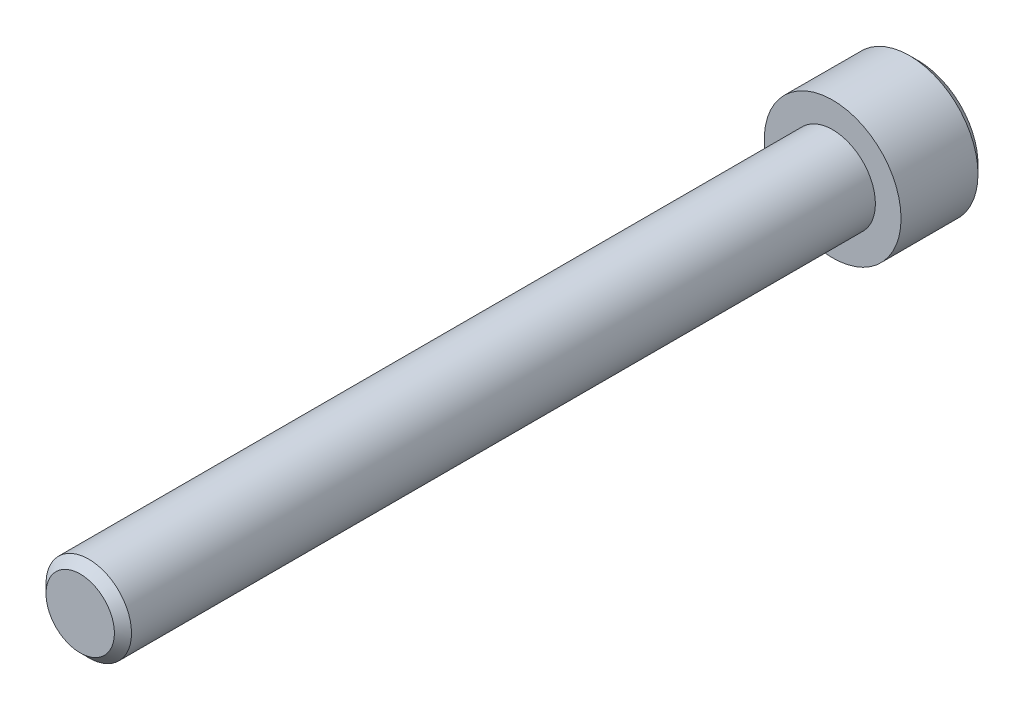
ISO-10303-21;
HEADER;
FILE_DESCRIPTION(('STEP AP214'),'2;1');
FILE_NAME('part.step','',(''),(''),'','','');
FILE_SCHEMA(('AUTOMOTIVE_DESIGN { 1 0 10303 214 1 1 1 1 }'));
ENDSEC;
DATA;
#1=APPLICATION_CONTEXT('core data for automotive mechanical design processes');
#2=APPLICATION_PROTOCOL_DEFINITION('international standard','automotive_design',2000,#1);
#3=PRODUCT_CONTEXT('',#1,'mechanical');
#4=PRODUCT('Part','Part','',(#3));
#5=PRODUCT_RELATED_PRODUCT_CATEGORY('part','',(#4));
#6=PRODUCT_DEFINITION_FORMATION('','',#4);
#7=PRODUCT_DEFINITION_CONTEXT('part definition',#1,'design');
#8=PRODUCT_DEFINITION('design','',#6,#7);
#9=PRODUCT_DEFINITION_SHAPE('','',#8);
#10=(LENGTH_UNIT() NAMED_UNIT(*) SI_UNIT(.MILLI.,.METRE.));
#11=(NAMED_UNIT(*) PLANE_ANGLE_UNIT() SI_UNIT($,.RADIAN.));
#12=(NAMED_UNIT(*) SI_UNIT($,.STERADIAN.) SOLID_ANGLE_UNIT());
#13=UNCERTAINTY_MEASURE_WITH_UNIT(LENGTH_MEASURE(1.E-05),#10,'distance_accuracy_value','');
#14=(GEOMETRIC_REPRESENTATION_CONTEXT(3) GLOBAL_UNCERTAINTY_ASSIGNED_CONTEXT((#13)) GLOBAL_UNIT_ASSIGNED_CONTEXT((#10,
#11,#12)) REPRESENTATION_CONTEXT('',''));
#15=CARTESIAN_POINT('',(0.,0.,0.));
#16=DIRECTION('',(0.,0.,1.));
#17=DIRECTION('',(1.,0.,0.));
#18=AXIS2_PLACEMENT_3D('',#15,#16,#17);
#19=CARTESIAN_POINT('',(0.,0.,0.));
#20=DIRECTION('',(0.,0.,1.));
#21=DIRECTION('',(1.,0.,0.));
#22=AXIS2_PLACEMENT_3D('',#19,#20,#21);
#23=CYLINDRICAL_SURFACE('',#22,8.);
#24=CARTESIAN_POINT('',(0.,0.,1.00000000089745));
#25=DIRECTION('',(0.,0.,-1.));
#26=DIRECTION('',(-1.,0.,0.));
#27=AXIS2_PLACEMENT_3D('',#24,#25,#26);
#28=CIRCLE('',#27,8.);
#29=CARTESIAN_POINT('',(-8.,0.,1.00000000089745));
#30=VERTEX_POINT('',#29);
#31=EDGE_CURVE('E47',#30,#30,#28,.F.);
#32=ORIENTED_EDGE('',*,*,#31,.T.);
#33=EDGE_LOOP('',(#32));
#34=FACE_BOUND('',#33,.T.);
#35=CARTESIAN_POINT('',(0.,0.,10.));
#36=DIRECTION('',(0.,0.,1.));
#37=DIRECTION('',(1.,0.,0.));
#38=AXIS2_PLACEMENT_3D('',#35,#36,#37);
#39=CIRCLE('',#38,8.);
#40=CARTESIAN_POINT('',(8.,0.,10.));
#41=VERTEX_POINT('',#40);
#42=EDGE_CURVE('E141',#41,#41,#39,.T.);
#43=ORIENTED_EDGE('',*,*,#42,.F.);
#44=EDGE_LOOP('',(#43));
#45=FACE_BOUND('',#44,.T.);
#46=ADVANCED_FACE('F38',(#34,#45),#23,.T.);
#47=CARTESIAN_POINT('',(8.,0.,0.));
#48=DIRECTION('',(0.,0.,-1.));
#49=DIRECTION('',(-1.,0.,0.));
#50=AXIS2_PLACEMENT_3D('',#47,#48,#49);
#51=PLANE('',#50);
#52=CARTESIAN_POINT('',(0.,0.,0.));
#53=DIRECTION('',(0.,0.,-1.));
#54=DIRECTION('',(-1.,0.,0.));
#55=AXIS2_PLACEMENT_3D('',#52,#53,#54);
#56=CIRCLE('',#55,7.00000000089744);
#57=CARTESIAN_POINT('',(-7.00000000089744,0.,0.));
#58=VERTEX_POINT('',#57);
#59=EDGE_CURVE('E11',#58,#58,#56,.T.);
#60=ORIENTED_EDGE('',*,*,#59,.T.);
#61=EDGE_LOOP('',(#60));
#62=FACE_BOUND('',#61,.T.);
#63=DIRECTION('',(1.,0.,0.));
#64=VECTOR('',#63,1.);
#65=CARTESIAN_POINT('',(-2.30940107675851,4.,0.));
#66=LINE('',#65,#64);
#67=CARTESIAN_POINT('',(-2.30940107675851,4.,0.));
#68=VERTEX_POINT('',#67);
#69=CARTESIAN_POINT('',(2.30940107675849,4.,0.));
#70=VERTEX_POINT('',#69);
#71=EDGE_CURVE('E54',#68,#70,#66,.T.);
#72=ORIENTED_EDGE('',*,*,#71,.F.);
#73=DIRECTION('',(0.499999999999996,0.866025403784441,0.));
#74=VECTOR('',#73,1.);
#75=CARTESIAN_POINT('',(-4.61880215351701,0.,0.));
#76=LINE('',#75,#74);
#77=CARTESIAN_POINT('',(-4.61880215351701,0.,0.));
#78=VERTEX_POINT('',#77);
#79=EDGE_CURVE('E137',#78,#68,#76,.T.);
#80=ORIENTED_EDGE('',*,*,#79,.F.);
#81=DIRECTION('',(-0.500000000000007,0.866025403784434,0.));
#82=VECTOR('',#81,1.);
#83=CARTESIAN_POINT('',(-2.30940107675848,-4.,0.));
#84=LINE('',#83,#82);
#85=CARTESIAN_POINT('',(-2.30940107675848,-4.,0.));
#86=VERTEX_POINT('',#85);
#87=EDGE_CURVE('E135',#86,#78,#84,.T.);
#88=ORIENTED_EDGE('',*,*,#87,.F.);
#89=DIRECTION('',(-1.,0.,0.));
#90=VECTOR('',#89,1.);
#91=CARTESIAN_POINT('',(2.30940107675851,-4.,0.));
#92=LINE('',#91,#90);
#93=CARTESIAN_POINT('',(2.30940107675851,-4.,0.));
#94=VERTEX_POINT('',#93);
#95=EDGE_CURVE('E102',#94,#86,#92,.T.);
#96=ORIENTED_EDGE('',*,*,#95,.F.);
#97=DIRECTION('',(-0.499999999999998,-0.86602540378444,0.));
#98=VECTOR('',#97,1.);
#99=CARTESIAN_POINT('',(4.61880215351701,0.,0.));
#100=LINE('',#99,#98);
#101=CARTESIAN_POINT('',(4.61880215351701,0.,0.));
#102=VERTEX_POINT('',#101);
#103=EDGE_CURVE('E131',#102,#94,#100,.T.);
#104=ORIENTED_EDGE('',*,*,#103,.F.);
#105=DIRECTION('',(0.500000000000004,-0.866025403784436,0.));
#106=VECTOR('',#105,1.);
#107=CARTESIAN_POINT('',(2.30940107675849,4.,0.));
#108=LINE('',#107,#106);
#109=EDGE_CURVE('E128',#70,#102,#108,.T.);
#110=ORIENTED_EDGE('',*,*,#109,.F.);
#111=EDGE_LOOP('',(#72,#80,#88,#96,#104,#110));
#112=FACE_BOUND('',#111,.T.);
#113=ADVANCED_FACE('F171',(#62,#112),#51,.T.);
#114=CARTESIAN_POINT('',(0.,0.,10.));
#115=DIRECTION('',(0.,0.,1.));
#116=DIRECTION('',(1.,0.,0.));
#117=AXIS2_PLACEMENT_3D('',#114,#115,#116);
#118=PLANE('',#117);
#119=CARTESIAN_POINT('',(0.,0.,10.));
#120=DIRECTION('',(0.,0.,1.));
#121=DIRECTION('',(1.,0.,0.));
#122=AXIS2_PLACEMENT_3D('',#119,#120,#121);
#123=CIRCLE('',#122,5.);
#124=CARTESIAN_POINT('',(5.,0.,10.));
#125=VERTEX_POINT('',#124);
#126=EDGE_CURVE('E147',#125,#125,#123,.T.);
#127=ORIENTED_EDGE('',*,*,#126,.F.);
#128=EDGE_LOOP('',(#127));
#129=FACE_BOUND('',#128,.T.);
#130=ORIENTED_EDGE('',*,*,#42,.T.);
#131=EDGE_LOOP('',(#130));
#132=FACE_BOUND('',#131,.T.);
#133=ADVANCED_FACE('F176',(#129,#132),#118,.T.);
#134=CARTESIAN_POINT('',(0.,0.,98.));
#135=DIRECTION('',(0.,0.,-1.));
#136=DIRECTION('',(-1.,0.,0.));
#137=AXIS2_PLACEMENT_3D('',#134,#135,#136);
#138=CYLINDRICAL_SURFACE('',#137,5.);
#139=CARTESIAN_POINT('',(0.,0.,97.0000000008974));
#140=DIRECTION('',(0.,0.,1.));
#141=DIRECTION('',(1.,0.,0.));
#142=AXIS2_PLACEMENT_3D('',#139,#140,#141);
#143=CIRCLE('',#142,5.);
#144=CARTESIAN_POINT('',(5.,0.,97.0000000008974));
#145=VERTEX_POINT('',#144);
#146=EDGE_CURVE('E155',#145,#145,#143,.F.);
#147=ORIENTED_EDGE('',*,*,#146,.T.);
#148=EDGE_LOOP('',(#147));
#149=FACE_BOUND('',#148,.T.);
#150=ORIENTED_EDGE('',*,*,#126,.T.);
#151=EDGE_LOOP('',(#150));
#152=FACE_BOUND('',#151,.T.);
#153=ADVANCED_FACE('F187',(#149,#152),#138,.T.);
#154=CARTESIAN_POINT('',(0.,0.,98.));
#155=DIRECTION('',(0.,0.,1.));
#156=DIRECTION('',(1.,0.,0.));
#157=AXIS2_PLACEMENT_3D('',#154,#155,#156);
#158=PLANE('',#157);
#159=CARTESIAN_POINT('',(0.,0.,98.));
#160=DIRECTION('',(0.,0.,1.));
#161=DIRECTION('',(1.,0.,0.));
#162=AXIS2_PLACEMENT_3D('',#159,#160,#161);
#163=CIRCLE('',#162,3.99999999910255);
#164=CARTESIAN_POINT('',(3.99999999910255,0.,98.));
#165=VERTEX_POINT('',#164);
#166=EDGE_CURVE('E150',#165,#165,#163,.T.);
#167=ORIENTED_EDGE('',*,*,#166,.T.);
#168=EDGE_LOOP('',(#167));
#169=FACE_BOUND('',#168,.T.);
#170=ADVANCED_FACE('F191',(#169),#158,.T.);
#171=CARTESIAN_POINT('',(-2.30940107675851,4.,7.));
#172=DIRECTION('',(0.,1.,0.));
#173=DIRECTION('',(0.,0.,1.));
#174=AXIS2_PLACEMENT_3D('',#171,#172,#173);
#175=PLANE('',#174);
#176=ORIENTED_EDGE('',*,*,#71,.T.);
#177=DIRECTION('',(0.,0.,-1.));
#178=VECTOR('',#177,1.);
#179=CARTESIAN_POINT('',(2.30940107675849,4.,7.));
#180=LINE('',#179,#178);
#181=CARTESIAN_POINT('',(2.30940107675849,4.,7.));
#182=VERTEX_POINT('',#181);
#183=EDGE_CURVE('E84',#182,#70,#180,.T.);
#184=ORIENTED_EDGE('',*,*,#183,.F.);
#185=DIRECTION('',(1.,0.,0.));
#186=VECTOR('',#185,1.);
#187=CARTESIAN_POINT('',(-2.30940107675851,4.,7.));
#188=LINE('',#187,#186);
#189=CARTESIAN_POINT('',(-2.30940107675851,4.,7.));
#190=VERTEX_POINT('',#189);
#191=EDGE_CURVE('E139',#190,#182,#188,.T.);
#192=ORIENTED_EDGE('',*,*,#191,.F.);
#193=DIRECTION('',(0.,0.,-1.));
#194=VECTOR('',#193,1.);
#195=CARTESIAN_POINT('',(-2.30940107675851,4.,7.));
#196=LINE('',#195,#194);
#197=EDGE_CURVE('E62',#190,#68,#196,.T.);
#198=ORIENTED_EDGE('',*,*,#197,.T.);
#199=EDGE_LOOP('',(#176,#184,#192,#198));
#200=FACE_BOUND('',#199,.T.);
#201=ADVANCED_FACE('F195',(#200),#175,.F.);
#202=CARTESIAN_POINT('',(-4.61880215351701,0.,7.));
#203=DIRECTION('',(-0.866025403784441,0.499999999999996,0.));
#204=DIRECTION('',(-0.499999999999996,-0.866025403784441,0.));
#205=AXIS2_PLACEMENT_3D('',#202,#203,#204);
#206=PLANE('',#205);
#207=ORIENTED_EDGE('',*,*,#79,.T.);
#208=ORIENTED_EDGE('',*,*,#197,.F.);
#209=DIRECTION('',(0.499999999999996,0.866025403784441,0.));
#210=VECTOR('',#209,1.);
#211=CARTESIAN_POINT('',(-4.61880215351701,0.,7.));
#212=LINE('',#211,#210);
#213=CARTESIAN_POINT('',(-4.61880215351701,0.,7.));
#214=VERTEX_POINT('',#213);
#215=EDGE_CURVE('E114',#214,#190,#212,.T.);
#216=ORIENTED_EDGE('',*,*,#215,.F.);
#217=DIRECTION('',(0.,0.,-1.));
#218=VECTOR('',#217,1.);
#219=CARTESIAN_POINT('',(-4.61880215351701,0.,7.));
#220=LINE('',#219,#218);
#221=EDGE_CURVE('E106',#214,#78,#220,.T.);
#222=ORIENTED_EDGE('',*,*,#221,.T.);
#223=EDGE_LOOP('',(#207,#208,#216,#222));
#224=FACE_BOUND('',#223,.T.);
#225=ADVANCED_FACE('F199',(#224),#206,.F.);
#226=CARTESIAN_POINT('',(-2.30940107675848,-4.,7.));
#227=DIRECTION('',(-0.866025403784434,-0.500000000000007,0.));
#228=DIRECTION('',(0.500000000000008,-0.866025403784434,0.));
#229=AXIS2_PLACEMENT_3D('',#226,#227,#228);
#230=PLANE('',#229);
#231=ORIENTED_EDGE('',*,*,#87,.T.);
#232=ORIENTED_EDGE('',*,*,#221,.F.);
#233=DIRECTION('',(-0.500000000000007,0.866025403784434,0.));
#234=VECTOR('',#233,1.);
#235=CARTESIAN_POINT('',(-2.30940107675848,-4.,7.));
#236=LINE('',#235,#234);
#237=CARTESIAN_POINT('',(-2.30940107675848,-4.,7.));
#238=VERTEX_POINT('',#237);
#239=EDGE_CURVE('E110',#238,#214,#236,.T.);
#240=ORIENTED_EDGE('',*,*,#239,.F.);
#241=DIRECTION('',(0.,0.,-1.));
#242=VECTOR('',#241,1.);
#243=CARTESIAN_POINT('',(-2.30940107675848,-4.,7.));
#244=LINE('',#243,#242);
#245=EDGE_CURVE('E95',#238,#86,#244,.T.);
#246=ORIENTED_EDGE('',*,*,#245,.T.);
#247=EDGE_LOOP('',(#231,#232,#240,#246));
#248=FACE_BOUND('',#247,.T.);
#249=ADVANCED_FACE('F111',(#248),#230,.F.);
#250=CARTESIAN_POINT('',(2.30940107675851,-4.,7.));
#251=DIRECTION('',(0.,-1.,0.));
#252=DIRECTION('',(0.,0.,-1.));
#253=AXIS2_PLACEMENT_3D('',#250,#251,#252);
#254=PLANE('',#253);
#255=ORIENTED_EDGE('',*,*,#95,.T.);
#256=ORIENTED_EDGE('',*,*,#245,.F.);
#257=DIRECTION('',(-1.,0.,0.));
#258=VECTOR('',#257,1.);
#259=CARTESIAN_POINT('',(2.30940107675851,-4.,7.));
#260=LINE('',#259,#258);
#261=CARTESIAN_POINT('',(2.30940107675851,-4.,7.));
#262=VERTEX_POINT('',#261);
#263=EDGE_CURVE('E99',#262,#238,#260,.T.);
#264=ORIENTED_EDGE('',*,*,#263,.F.);
#265=DIRECTION('',(0.,0.,-1.));
#266=VECTOR('',#265,1.);
#267=CARTESIAN_POINT('',(2.30940107675851,-4.,7.));
#268=LINE('',#267,#266);
#269=EDGE_CURVE('E107',#262,#94,#268,.T.);
#270=ORIENTED_EDGE('',*,*,#269,.T.);
#271=EDGE_LOOP('',(#255,#256,#264,#270));
#272=FACE_BOUND('',#271,.T.);
#273=ADVANCED_FACE('F97',(#272),#254,.F.);
#274=CARTESIAN_POINT('',(4.61880215351701,0.,7.));
#275=DIRECTION('',(0.86602540378444,-0.499999999999998,0.));
#276=DIRECTION('',(0.499999999999998,0.86602540378444,0.));
#277=AXIS2_PLACEMENT_3D('',#274,#275,#276);
#278=PLANE('',#277);
#279=ORIENTED_EDGE('',*,*,#103,.T.);
#280=ORIENTED_EDGE('',*,*,#269,.F.);
#281=DIRECTION('',(-0.499999999999998,-0.86602540378444,0.));
#282=VECTOR('',#281,1.);
#283=CARTESIAN_POINT('',(4.61880215351701,0.,7.));
#284=LINE('',#283,#282);
#285=CARTESIAN_POINT('',(4.61880215351701,0.,7.));
#286=VERTEX_POINT('',#285);
#287=EDGE_CURVE('E120',#286,#262,#284,.T.);
#288=ORIENTED_EDGE('',*,*,#287,.F.);
#289=DIRECTION('',(0.,0.,-1.));
#290=VECTOR('',#289,1.);
#291=CARTESIAN_POINT('',(4.61880215351701,0.,7.));
#292=LINE('',#291,#290);
#293=EDGE_CURVE('E144',#286,#102,#292,.T.);
#294=ORIENTED_EDGE('',*,*,#293,.T.);
#295=EDGE_LOOP('',(#279,#280,#288,#294));
#296=FACE_BOUND('',#295,.T.);
#297=ADVANCED_FACE('F203',(#296),#278,.F.);
#298=CARTESIAN_POINT('',(2.30940107675849,4.,7.));
#299=DIRECTION('',(0.866025403784436,0.500000000000004,0.));
#300=DIRECTION('',(-0.500000000000004,0.866025403784436,0.));
#301=AXIS2_PLACEMENT_3D('',#298,#299,#300);
#302=PLANE('',#301);
#303=ORIENTED_EDGE('',*,*,#109,.T.);
#304=ORIENTED_EDGE('',*,*,#293,.F.);
#305=DIRECTION('',(0.500000000000004,-0.866025403784436,0.));
#306=VECTOR('',#305,1.);
#307=CARTESIAN_POINT('',(2.30940107675849,4.,7.));
#308=LINE('',#307,#306);
#309=EDGE_CURVE('E122',#182,#286,#308,.T.);
#310=ORIENTED_EDGE('',*,*,#309,.F.);
#311=ORIENTED_EDGE('',*,*,#183,.T.);
#312=EDGE_LOOP('',(#303,#304,#310,#311));
#313=FACE_BOUND('',#312,.T.);
#314=ADVANCED_FACE('F200',(#313),#302,.F.);
#315=CARTESIAN_POINT('',(0.,0.,7.));
#316=DIRECTION('',(0.,0.,-1.));
#317=DIRECTION('',(-1.,0.,0.));
#318=AXIS2_PLACEMENT_3D('',#315,#316,#317);
#319=PLANE('',#318);
#320=ORIENTED_EDGE('',*,*,#191,.T.);
#321=ORIENTED_EDGE('',*,*,#309,.T.);
#322=ORIENTED_EDGE('',*,*,#287,.T.);
#323=ORIENTED_EDGE('',*,*,#263,.T.);
#324=ORIENTED_EDGE('',*,*,#239,.T.);
#325=ORIENTED_EDGE('',*,*,#215,.T.);
#326=EDGE_LOOP('',(#320,#321,#322,#323,#324,#325));
#327=FACE_BOUND('',#326,.T.);
#328=ADVANCED_FACE('F117',(#327),#319,.T.);
#329=CARTESIAN_POINT('',(0.,0.,98.));
#330=DIRECTION('',(0.,0.,-1.));
#331=DIRECTION('',(-1.,0.,0.));
#332=AXIS2_PLACEMENT_3D('',#329,#330,#331);
#333=CONICAL_SURFACE('',#332,3.99999999910255,0.785398164294888);
#334=ORIENTED_EDGE('',*,*,#146,.F.);
#335=EDGE_LOOP('',(#334));
#336=FACE_BOUND('',#335,.T.);
#337=ORIENTED_EDGE('',*,*,#166,.F.);
#338=EDGE_LOOP('',(#337));
#339=FACE_BOUND('',#338,.T.);
#340=ADVANCED_FACE('F163',(#336,#339),#333,.T.);
#341=CARTESIAN_POINT('',(0.,0.,1.00000000089745));
#342=DIRECTION('',(0.,0.,1.));
#343=DIRECTION('',(1.,0.,0.));
#344=AXIS2_PLACEMENT_3D('',#341,#342,#343);
#345=CONICAL_SURFACE('',#344,8.,0.785398162500005);
#346=ORIENTED_EDGE('',*,*,#59,.F.);
#347=EDGE_LOOP('',(#346));
#348=FACE_BOUND('',#347,.T.);
#349=ORIENTED_EDGE('',*,*,#31,.F.);
#350=EDGE_LOOP('',(#349));
#351=FACE_BOUND('',#350,.T.);
#352=ADVANCED_FACE('F41',(#348,#351),#345,.T.);
#353=CLOSED_SHELL('',(#46,#113,#133,#153,#170,#201,#225,#249,#273,#297,#314,#328,#340,#352));
#354=MANIFOLD_SOLID_BREP('B2',#353);
#355=ADVANCED_BREP_SHAPE_REPRESENTATION('',(#18,#354),#14);
#356=SHAPE_DEFINITION_REPRESENTATION(#9,#355);
ENDSEC;
END-ISO-10303-21;
